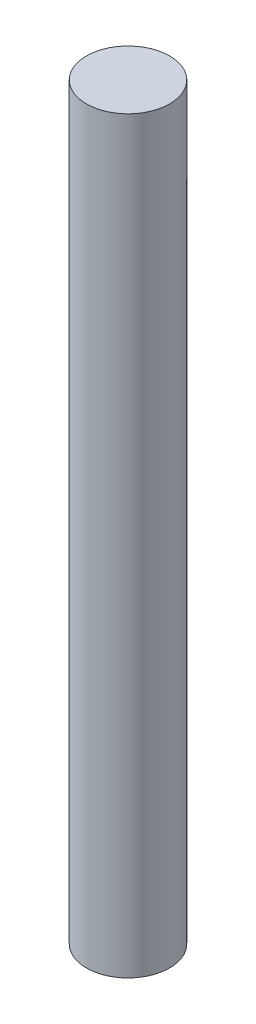
ISO-10303-21;
HEADER;
FILE_DESCRIPTION(('STEP AP214'),'2;1');
FILE_NAME('part.step','',(''),(''),'','','');
FILE_SCHEMA(('AUTOMOTIVE_DESIGN { 1 0 10303 214 1 1 1 1 }'));
ENDSEC;
DATA;
#1=APPLICATION_CONTEXT('core data for automotive mechanical design processes');
#2=APPLICATION_PROTOCOL_DEFINITION('international standard','automotive_design',2000,#1);
#3=PRODUCT_CONTEXT('',#1,'mechanical');
#4=PRODUCT('Part','Part','',(#3));
#5=PRODUCT_RELATED_PRODUCT_CATEGORY('part','',(#4));
#6=PRODUCT_DEFINITION_FORMATION('','',#4);
#7=PRODUCT_DEFINITION_CONTEXT('part definition',#1,'design');
#8=PRODUCT_DEFINITION('design','',#6,#7);
#9=PRODUCT_DEFINITION_SHAPE('','',#8);
#10=(LENGTH_UNIT() NAMED_UNIT(*) SI_UNIT(.MILLI.,.METRE.));
#11=(NAMED_UNIT(*) PLANE_ANGLE_UNIT() SI_UNIT($,.RADIAN.));
#12=(NAMED_UNIT(*) SI_UNIT($,.STERADIAN.) SOLID_ANGLE_UNIT());
#13=UNCERTAINTY_MEASURE_WITH_UNIT(LENGTH_MEASURE(1.E-05),#10,'distance_accuracy_value','');
#14=(GEOMETRIC_REPRESENTATION_CONTEXT(3) GLOBAL_UNCERTAINTY_ASSIGNED_CONTEXT((#13)) GLOBAL_UNIT_ASSIGNED_CONTEXT((#10,
#11,#12)) REPRESENTATION_CONTEXT('',''));
#15=CARTESIAN_POINT('',(0.,0.,0.));
#16=DIRECTION('',(0.,0.,1.));
#17=DIRECTION('',(1.,0.,0.));
#18=AXIS2_PLACEMENT_3D('',#15,#16,#17);
#19=CARTESIAN_POINT('',(0.,90.,0.));
#20=DIRECTION('',(0.,-1.,0.));
#21=DIRECTION('',(0.,0.,-1.));
#22=AXIS2_PLACEMENT_3D('',#19,#20,#21);
#23=CYLINDRICAL_SURFACE('',#22,5.);
#24=CARTESIAN_POINT('',(0.,90.,0.));
#25=DIRECTION('',(0.,1.,0.));
#26=DIRECTION('',(0.,0.,1.));
#27=AXIS2_PLACEMENT_3D('',#24,#25,#26);
#28=CIRCLE('',#27,5.);
#29=CARTESIAN_POINT('',(0.,90.,-5.));
#30=VERTEX_POINT('',#29);
#31=EDGE_CURVE('E10',#30,#30,#28,.T.);
#32=CARTESIAN_POINT('',(0.,0.,0.));
#33=DIRECTION('',(0.,1.,0.));
#34=DIRECTION('',(0.,0.,1.));
#35=AXIS2_PLACEMENT_3D('',#32,#33,#34);
#36=CIRCLE('',#35,5.);
#37=CARTESIAN_POINT('',(0.,0.,-5.));
#38=VERTEX_POINT('',#37);
#39=EDGE_CURVE('E34',#38,#38,#36,.T.);
#40=CARTESIAN_POINT('',(0.,90.,-5.));
#41=CARTESIAN_POINT('',(0.,89.0625,-5.));
#42=CARTESIAN_POINT('',(0.,88.125,-5.));
#43=CARTESIAN_POINT('',(0.,86.25,-5.));
#44=CARTESIAN_POINT('',(0.,85.3125,-5.));
#45=CARTESIAN_POINT('',(0.,83.4375,-5.));
#46=CARTESIAN_POINT('',(0.,82.5,-5.));
#47=CARTESIAN_POINT('',(0.,80.625,-5.));
#48=CARTESIAN_POINT('',(0.,79.6875,-5.));
#49=CARTESIAN_POINT('',(0.,77.8125,-5.));
#50=CARTESIAN_POINT('',(0.,76.875,-5.));
#51=CARTESIAN_POINT('',(0.,75.,-5.));
#52=CARTESIAN_POINT('',(0.,74.0625,-5.));
#53=CARTESIAN_POINT('',(0.,72.1875,-5.));
#54=CARTESIAN_POINT('',(0.,71.25,-5.));
#55=CARTESIAN_POINT('',(0.,69.375,-5.));
#56=CARTESIAN_POINT('',(0.,68.4375,-5.));
#57=CARTESIAN_POINT('',(0.,66.5625,-5.));
#58=CARTESIAN_POINT('',(0.,65.625,-5.));
#59=CARTESIAN_POINT('',(0.,63.75,-5.));
#60=CARTESIAN_POINT('',(0.,62.8125,-5.));
#61=CARTESIAN_POINT('',(0.,60.9375,-5.));
#62=CARTESIAN_POINT('',(0.,60.,-5.));
#63=CARTESIAN_POINT('',(0.,58.125,-5.));
#64=CARTESIAN_POINT('',(0.,57.1875,-5.));
#65=CARTESIAN_POINT('',(0.,55.3125,-5.));
#66=CARTESIAN_POINT('',(0.,54.375,-5.));
#67=CARTESIAN_POINT('',(0.,52.5,-5.));
#68=CARTESIAN_POINT('',(0.,51.5625,-5.));
#69=CARTESIAN_POINT('',(0.,49.6875,-5.));
#70=CARTESIAN_POINT('',(0.,48.75,-5.));
#71=CARTESIAN_POINT('',(0.,46.875,-5.));
#72=CARTESIAN_POINT('',(0.,45.9375,-5.));
#73=CARTESIAN_POINT('',(0.,44.0625,-5.));
#74=CARTESIAN_POINT('',(0.,43.125,-5.));
#75=CARTESIAN_POINT('',(0.,41.25,-5.));
#76=CARTESIAN_POINT('',(0.,40.3125,-5.));
#77=CARTESIAN_POINT('',(0.,38.4375,-5.));
#78=CARTESIAN_POINT('',(0.,37.5,-5.));
#79=CARTESIAN_POINT('',(0.,35.625,-5.));
#80=CARTESIAN_POINT('',(0.,34.6875,-5.));
#81=CARTESIAN_POINT('',(0.,32.8125,-5.));
#82=CARTESIAN_POINT('',(0.,31.875,-5.));
#83=CARTESIAN_POINT('',(0.,30.,-5.));
#84=CARTESIAN_POINT('',(0.,29.0625,-5.));
#85=CARTESIAN_POINT('',(0.,27.1875,-5.));
#86=CARTESIAN_POINT('',(0.,26.25,-5.));
#87=CARTESIAN_POINT('',(0.,24.375,-5.));
#88=CARTESIAN_POINT('',(0.,23.4375,-5.));
#89=CARTESIAN_POINT('',(0.,21.5625,-5.));
#90=CARTESIAN_POINT('',(0.,20.625,-5.));
#91=CARTESIAN_POINT('',(0.,18.75,-5.));
#92=CARTESIAN_POINT('',(0.,17.8125,-5.));
#93=CARTESIAN_POINT('',(0.,15.9375,-5.));
#94=CARTESIAN_POINT('',(0.,15.,-5.));
#95=CARTESIAN_POINT('',(0.,13.125,-5.));
#96=CARTESIAN_POINT('',(0.,12.1875,-5.));
#97=CARTESIAN_POINT('',(0.,10.3125,-5.));
#98=CARTESIAN_POINT('',(0.,9.37499999999999,-5.));
#99=CARTESIAN_POINT('',(0.,7.49999999999999,-5.));
#100=CARTESIAN_POINT('',(0.,6.56249999999999,-5.));
#101=CARTESIAN_POINT('',(0.,4.68749999999999,-5.));
#102=CARTESIAN_POINT('',(0.,3.74999999999998,-5.));
#103=CARTESIAN_POINT('',(0.,1.87499999999998,-5.));
#104=CARTESIAN_POINT('',(0.,0.937499999999986,-5.));
#105=CARTESIAN_POINT('',(0.,0.,-5.));
#106=B_SPLINE_CURVE_WITH_KNOTS('',3,(#40,#41,#42,#43,#44,#45,#46,#47,#48,#49,#50,#51,#52,#53,
#54,#55,#56,#57,#58,#59,#60,#61,#62,#63,#64,#65,#66,#67,#68,#69,#70,#71,#72,#73,#74,#75,#76,#77,
#78,#79,#80,#81,#82,#83,#84,#85,#86,#87,#88,#89,#90,#91,#92,#93,#94,#95,#96,#97,#98,#99,#100,
#101,#102,#103,#104,#105),.UNSPECIFIED.,.F.,.F.,(4,2,2,2,2,2,2,2,2,2,2,2,2,2,2,2,2,2,2,2,2,2,2,
2,2,2,2,2,2,2,2,2,4),(0.,2.8125,5.62499999999999,8.43749999999999,11.25,14.0625,16.875,19.6875,
22.5,25.3125,28.125,30.9375,33.75,36.5625,39.375,42.1875,45.,47.8125,50.625,53.4375,56.25,
59.0625,61.875,64.6875,67.5,70.3125,73.125,75.9375,78.75,81.5625,84.375,87.1875,90.),.UNSPECIFIED.);
#107=EDGE_CURVE('BSEAM31',#30,#38,#106,.T.);
#108=ORIENTED_EDGE('',*,*,#31,.F.);
#109=ORIENTED_EDGE('',*,*,#39,.T.);
#110=ORIENTED_EDGE('',*,*,#107,.T.);
#111=ORIENTED_EDGE('',*,*,#107,.F.);
#112=EDGE_LOOP('',(#108,#110,#109,#111));
#113=FACE_BOUND('',#112,.T.);
#114=ADVANCED_FACE('F31',(#113),#23,.T.);
#115=CARTESIAN_POINT('',(0.,90.,0.));
#116=DIRECTION('',(0.,1.,0.));
#117=DIRECTION('',(0.,0.,1.));
#118=AXIS2_PLACEMENT_3D('',#115,#116,#117);
#119=PLANE('',#118);
#120=ORIENTED_EDGE('',*,*,#31,.T.);
#121=EDGE_LOOP('',(#120));
#122=FACE_BOUND('',#121,.T.);
#123=ADVANCED_FACE('F46',(#122),#119,.T.);
#124=CARTESIAN_POINT('',(0.,0.,0.));
#125=DIRECTION('',(0.,1.,0.));
#126=DIRECTION('',(0.,0.,1.));
#127=AXIS2_PLACEMENT_3D('',#124,#125,#126);
#128=PLANE('',#127);
#129=ORIENTED_EDGE('',*,*,#39,.F.);
#130=EDGE_LOOP('',(#129));
#131=FACE_BOUND('',#130,.T.);
#132=ADVANCED_FACE('F44',(#131),#128,.F.);
#133=CLOSED_SHELL('',(#114,#123,#132));
#134=MANIFOLD_SOLID_BREP('B2',#133);
#135=ADVANCED_BREP_SHAPE_REPRESENTATION('',(#18,#134),#14);
#136=SHAPE_DEFINITION_REPRESENTATION(#9,#135);
ENDSEC;
END-ISO-10303-21;
